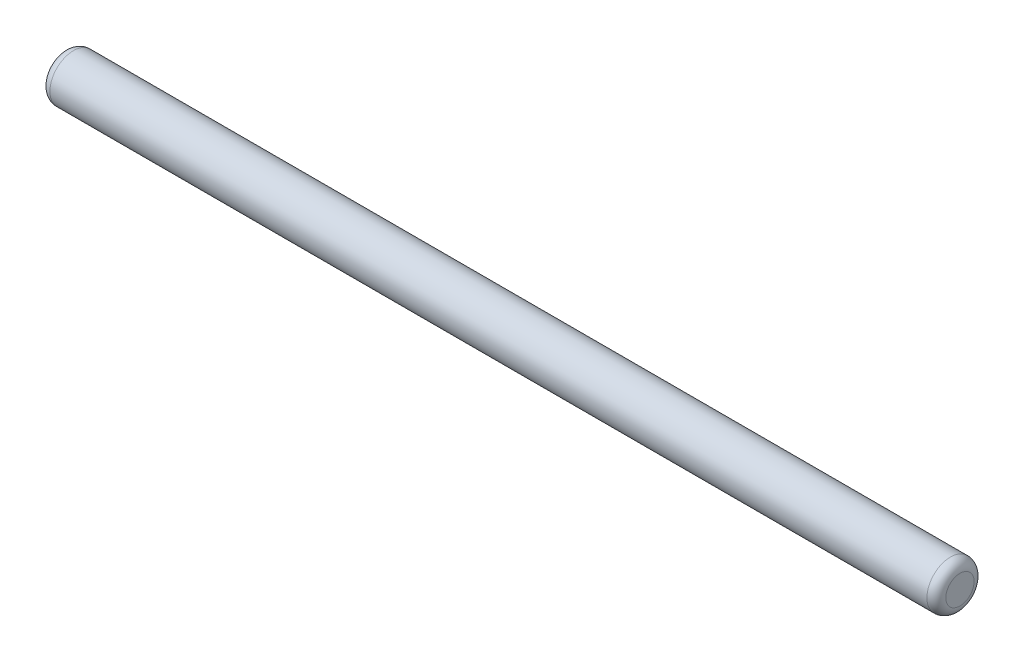
ISO-10303-21;
HEADER;
FILE_DESCRIPTION(('STEP AP214'),'2;1');
FILE_NAME('part.step','',(''),(''),'','','');
FILE_SCHEMA(('AUTOMOTIVE_DESIGN { 1 0 10303 214 1 1 1 1 }'));
ENDSEC;
DATA;
#1=APPLICATION_CONTEXT('core data for automotive mechanical design processes');
#2=APPLICATION_PROTOCOL_DEFINITION('international standard','automotive_design',2000,#1);
#3=PRODUCT_CONTEXT('',#1,'mechanical');
#4=PRODUCT('Part','Part','',(#3));
#5=PRODUCT_RELATED_PRODUCT_CATEGORY('part','',(#4));
#6=PRODUCT_DEFINITION_FORMATION('','',#4);
#7=PRODUCT_DEFINITION_CONTEXT('part definition',#1,'design');
#8=PRODUCT_DEFINITION('design','',#6,#7);
#9=PRODUCT_DEFINITION_SHAPE('','',#8);
#10=(LENGTH_UNIT() NAMED_UNIT(*) SI_UNIT(.MILLI.,.METRE.));
#11=(NAMED_UNIT(*) PLANE_ANGLE_UNIT() SI_UNIT($,.RADIAN.));
#12=(NAMED_UNIT(*) SI_UNIT($,.STERADIAN.) SOLID_ANGLE_UNIT());
#13=UNCERTAINTY_MEASURE_WITH_UNIT(LENGTH_MEASURE(1.E-05),#10,'distance_accuracy_value','');
#14=(GEOMETRIC_REPRESENTATION_CONTEXT(3) GLOBAL_UNCERTAINTY_ASSIGNED_CONTEXT((#13)) GLOBAL_UNIT_ASSIGNED_CONTEXT((#10,
#11,#12)) REPRESENTATION_CONTEXT('',''));
#15=CARTESIAN_POINT('',(0.,0.,0.));
#16=DIRECTION('',(0.,0.,1.));
#17=DIRECTION('',(1.,0.,0.));
#18=AXIS2_PLACEMENT_3D('',#15,#16,#17);
#19=CARTESIAN_POINT('',(120.65,0.,0.));
#20=DIRECTION('',(-1.,0.,0.));
#21=DIRECTION('',(0.,0.,1.));
#22=AXIS2_PLACEMENT_3D('',#19,#20,#21);
#23=CYLINDRICAL_SURFACE('',#22,3.175);
#24=CARTESIAN_POINT('',(1.26999999999998,0.,0.));
#25=DIRECTION('',(1.,0.,0.));
#26=DIRECTION('',(0.,0.,-1.));
#27=AXIS2_PLACEMENT_3D('',#24,#25,#26);
#28=CIRCLE('',#27,3.175);
#29=CARTESIAN_POINT('',(1.26999999999997,0.,3.175));
#30=VERTEX_POINT('',#29);
#31=EDGE_CURVE('E50',#30,#30,#28,.T.);
#32=CARTESIAN_POINT('',(119.38,0.,0.));
#33=DIRECTION('',(1.,0.,0.));
#34=DIRECTION('',(0.,0.,-1.));
#35=AXIS2_PLACEMENT_3D('',#32,#33,#34);
#36=CIRCLE('',#35,3.175);
#37=CARTESIAN_POINT('',(119.38,0.,3.175));
#38=VERTEX_POINT('',#37);
#39=EDGE_CURVE('E55',#38,#38,#36,.F.);
#40=CARTESIAN_POINT('',(1.26999999999997,0.,3.175));
#41=CARTESIAN_POINT('',(2.50031249999997,0.,3.175));
#42=CARTESIAN_POINT('',(3.73062499999997,0.,3.175));
#43=CARTESIAN_POINT('',(6.19124999999997,0.,3.175));
#44=CARTESIAN_POINT('',(7.42156249999997,0.,3.175));
#45=CARTESIAN_POINT('',(9.88218749999997,0.,3.175));
#46=CARTESIAN_POINT('',(11.1125,0.,3.175));
#47=CARTESIAN_POINT('',(13.573125,0.,3.175));
#48=CARTESIAN_POINT('',(14.8034375,0.,3.175));
#49=CARTESIAN_POINT('',(17.2640625,0.,3.175));
#50=CARTESIAN_POINT('',(18.494375,0.,3.175));
#51=CARTESIAN_POINT('',(20.955,0.,3.175));
#52=CARTESIAN_POINT('',(22.1853125,0.,3.175));
#53=CARTESIAN_POINT('',(24.6459375,0.,3.175));
#54=CARTESIAN_POINT('',(25.87625,0.,3.175));
#55=CARTESIAN_POINT('',(28.336875,0.,3.175));
#56=CARTESIAN_POINT('',(29.5671875,0.,3.175));
#57=CARTESIAN_POINT('',(32.0278125,0.,3.175));
#58=CARTESIAN_POINT('',(33.258125,0.,3.175));
#59=CARTESIAN_POINT('',(35.71875,0.,3.175));
#60=CARTESIAN_POINT('',(36.9490625,0.,3.175));
#61=CARTESIAN_POINT('',(39.4096875,0.,3.175));
#62=CARTESIAN_POINT('',(40.64,0.,3.175));
#63=CARTESIAN_POINT('',(43.100625,0.,3.175));
#64=CARTESIAN_POINT('',(44.3309375,0.,3.175));
#65=CARTESIAN_POINT('',(46.7915625,0.,3.175));
#66=CARTESIAN_POINT('',(48.021875,0.,3.175));
#67=CARTESIAN_POINT('',(50.4825,0.,3.175));
#68=CARTESIAN_POINT('',(51.7128125,0.,3.175));
#69=CARTESIAN_POINT('',(54.1734375,0.,3.175));
#70=CARTESIAN_POINT('',(55.40375,0.,3.175));
#71=CARTESIAN_POINT('',(57.864375,0.,3.175));
#72=CARTESIAN_POINT('',(59.0946875,0.,3.175));
#73=CARTESIAN_POINT('',(61.5553125,0.,3.175));
#74=CARTESIAN_POINT('',(62.785625,0.,3.175));
#75=CARTESIAN_POINT('',(65.24625,0.,3.175));
#76=CARTESIAN_POINT('',(66.4765625,0.,3.175));
#77=CARTESIAN_POINT('',(68.9371875,0.,3.175));
#78=CARTESIAN_POINT('',(70.1675,0.,3.175));
#79=CARTESIAN_POINT('',(72.628125,0.,3.175));
#80=CARTESIAN_POINT('',(73.8584375,0.,3.175));
#81=CARTESIAN_POINT('',(76.3190625,0.,3.175));
#82=CARTESIAN_POINT('',(77.549375,0.,3.175));
#83=CARTESIAN_POINT('',(80.01,0.,3.175));
#84=CARTESIAN_POINT('',(81.2403125,0.,3.175));
#85=CARTESIAN_POINT('',(83.7009375,0.,3.175));
#86=CARTESIAN_POINT('',(84.93125,0.,3.175));
#87=CARTESIAN_POINT('',(87.391875,0.,3.175));
#88=CARTESIAN_POINT('',(88.6221875,0.,3.175));
#89=CARTESIAN_POINT('',(91.0828125,0.,3.175));
#90=CARTESIAN_POINT('',(92.313125,0.,3.175));
#91=CARTESIAN_POINT('',(94.77375,0.,3.175));
#92=CARTESIAN_POINT('',(96.0040625,0.,3.175));
#93=CARTESIAN_POINT('',(98.4646875,0.,3.175));
#94=CARTESIAN_POINT('',(99.695,0.,3.175));
#95=CARTESIAN_POINT('',(102.155625,0.,3.175));
#96=CARTESIAN_POINT('',(103.3859375,0.,3.175));
#97=CARTESIAN_POINT('',(105.8465625,0.,3.175));
#98=CARTESIAN_POINT('',(107.076875,0.,3.175));
#99=CARTESIAN_POINT('',(109.5375,0.,3.175));
#100=CARTESIAN_POINT('',(110.7678125,0.,3.175));
#101=CARTESIAN_POINT('',(113.2284375,0.,3.175));
#102=CARTESIAN_POINT('',(114.45875,0.,3.175));
#103=CARTESIAN_POINT('',(116.919375,0.,3.175));
#104=CARTESIAN_POINT('',(118.1496875,0.,3.175));
#105=CARTESIAN_POINT('',(119.38,0.,3.175));
#106=B_SPLINE_CURVE_WITH_KNOTS('',3,(#40,#41,#42,#43,#44,#45,#46,#47,#48,#49,#50,#51,#52,#53,
#54,#55,#56,#57,#58,#59,#60,#61,#62,#63,#64,#65,#66,#67,#68,#69,#70,#71,#72,#73,#74,#75,#76,#77,
#78,#79,#80,#81,#82,#83,#84,#85,#86,#87,#88,#89,#90,#91,#92,#93,#94,#95,#96,#97,#98,#99,#100,
#101,#102,#103,#104,#105),.UNSPECIFIED.,.F.,.F.,(4,2,2,2,2,2,2,2,2,2,2,2,2,2,2,2,2,2,2,2,2,2,2,
2,2,2,2,2,2,2,2,2,4),(0.,3.6909375,7.38187500000001,11.0728125,14.76375,18.4546875,22.145625,
25.8365625,29.5275,33.2184375,36.909375,40.6003125,44.29125,47.9821875,51.673125,55.3640625,
59.055,62.7459375,66.436875,70.1278125,73.81875,77.5096875,81.200625,84.8915625,88.5825,
92.2734375,95.964375,99.6553125,103.34625,107.0371875,110.728125,114.4190625,118.11),.UNSPECIFIED.);
#107=EDGE_CURVE('BSEAM37',#30,#38,#106,.T.);
#108=ORIENTED_EDGE('',*,*,#31,.T.);
#109=ORIENTED_EDGE('',*,*,#39,.T.);
#110=ORIENTED_EDGE('',*,*,#107,.T.);
#111=ORIENTED_EDGE('',*,*,#107,.F.);
#112=EDGE_LOOP('',(#108,#110,#109,#111));
#113=FACE_BOUND('',#112,.T.);
#114=ADVANCED_FACE('F37',(#113),#23,.T.);
#115=CARTESIAN_POINT('',(120.65,0.,0.));
#116=DIRECTION('',(1.,0.,0.));
#117=DIRECTION('',(0.,0.,-1.));
#118=AXIS2_PLACEMENT_3D('',#115,#116,#117);
#119=PLANE('',#118);
#120=CARTESIAN_POINT('',(120.65,0.,0.));
#121=DIRECTION('',(1.,0.,0.));
#122=DIRECTION('',(0.,0.,-1.));
#123=AXIS2_PLACEMENT_3D('',#120,#121,#122);
#124=CIRCLE('',#123,1.905);
#125=CARTESIAN_POINT('',(120.65,0.,-1.905));
#126=VERTEX_POINT('',#125);
#127=EDGE_CURVE('E10',#126,#126,#124,.T.);
#128=ORIENTED_EDGE('',*,*,#127,.T.);
#129=EDGE_LOOP('',(#128));
#130=FACE_BOUND('',#129,.T.);
#131=ADVANCED_FACE('F72',(#130),#119,.T.);
#132=CARTESIAN_POINT('',(0.,0.,0.));
#133=DIRECTION('',(1.,0.,0.));
#134=DIRECTION('',(0.,0.,-1.));
#135=AXIS2_PLACEMENT_3D('',#132,#133,#134);
#136=PLANE('',#135);
#137=CARTESIAN_POINT('',(0.,0.,0.));
#138=DIRECTION('',(1.,0.,0.));
#139=DIRECTION('',(0.,0.,-1.));
#140=AXIS2_PLACEMENT_3D('',#137,#138,#139);
#141=CIRCLE('',#140,1.905);
#142=CARTESIAN_POINT('',(0.,0.,-1.905));
#143=VERTEX_POINT('',#142);
#144=EDGE_CURVE('E45',#143,#143,#141,.F.);
#145=ORIENTED_EDGE('',*,*,#144,.T.);
#146=EDGE_LOOP('',(#145));
#147=FACE_BOUND('',#146,.T.);
#148=ADVANCED_FACE('F69',(#147),#136,.F.);
#149=CARTESIAN_POINT('',(1.26999999999999,0.,0.));
#150=DIRECTION('',(1.,0.,0.));
#151=DIRECTION('',(0.,0.,-1.));
#152=AXIS2_PLACEMENT_3D('',#149,#150,#151);
#153=TOROIDAL_SURFACE('',#152,1.905,1.27);
#154=ORIENTED_EDGE('',*,*,#144,.F.);
#155=EDGE_LOOP('',(#154));
#156=FACE_BOUND('',#155,.T.);
#157=ORIENTED_EDGE('',*,*,#31,.F.);
#158=EDGE_LOOP('',(#157));
#159=FACE_BOUND('',#158,.T.);
#160=ADVANCED_FACE('F65',(#156,#159),#153,.T.);
#161=CARTESIAN_POINT('',(119.38,0.,0.));
#162=DIRECTION('',(1.,0.,0.));
#163=DIRECTION('',(0.,0.,-1.));
#164=AXIS2_PLACEMENT_3D('',#161,#162,#163);
#165=TOROIDAL_SURFACE('',#164,1.905,1.27);
#166=ORIENTED_EDGE('',*,*,#39,.F.);
#167=EDGE_LOOP('',(#166));
#168=FACE_BOUND('',#167,.T.);
#169=ORIENTED_EDGE('',*,*,#127,.F.);
#170=EDGE_LOOP('',(#169));
#171=FACE_BOUND('',#170,.T.);
#172=ADVANCED_FACE('F39',(#168,#171),#165,.T.);
#173=CLOSED_SHELL('',(#114,#131,#148,#160,#172));
#174=MANIFOLD_SOLID_BREP('B2',#173);
#175=ADVANCED_BREP_SHAPE_REPRESENTATION('',(#18,#174),#14);
#176=SHAPE_DEFINITION_REPRESENTATION(#9,#175);
ENDSEC;
END-ISO-10303-21;
